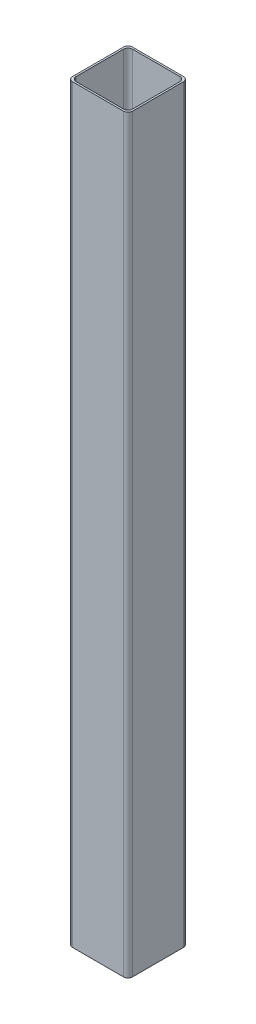
ISO-10303-21;
HEADER;
FILE_DESCRIPTION(('STEP AP214'),'2;1');
FILE_NAME('part.step','',(''),(''),'','','');
FILE_SCHEMA(('AUTOMOTIVE_DESIGN { 1 0 10303 214 1 1 1 1 }'));
ENDSEC;
DATA;
#1=APPLICATION_CONTEXT('core data for automotive mechanical design processes');
#2=APPLICATION_PROTOCOL_DEFINITION('international standard','automotive_design',2000,#1);
#3=PRODUCT_CONTEXT('',#1,'mechanical');
#4=PRODUCT('Part','Part','',(#3));
#5=PRODUCT_RELATED_PRODUCT_CATEGORY('part','',(#4));
#6=PRODUCT_DEFINITION_FORMATION('','',#4);
#7=PRODUCT_DEFINITION_CONTEXT('part definition',#1,'design');
#8=PRODUCT_DEFINITION('design','',#6,#7);
#9=PRODUCT_DEFINITION_SHAPE('','',#8);
#10=(LENGTH_UNIT() NAMED_UNIT(*) SI_UNIT(.MILLI.,.METRE.));
#11=(NAMED_UNIT(*) PLANE_ANGLE_UNIT() SI_UNIT($,.RADIAN.));
#12=(NAMED_UNIT(*) SI_UNIT($,.STERADIAN.) SOLID_ANGLE_UNIT());
#13=UNCERTAINTY_MEASURE_WITH_UNIT(LENGTH_MEASURE(1.E-05),#10,'distance_accuracy_value','');
#14=(GEOMETRIC_REPRESENTATION_CONTEXT(3) GLOBAL_UNCERTAINTY_ASSIGNED_CONTEXT((#13)) GLOBAL_UNIT_ASSIGNED_CONTEXT((#10,
#11,#12)) REPRESENTATION_CONTEXT('',''));
#15=CARTESIAN_POINT('',(0.,0.,0.));
#16=DIRECTION('',(0.,0.,1.));
#17=DIRECTION('',(1.,0.,0.));
#18=AXIS2_PLACEMENT_3D('',#15,#16,#17);
#19=CARTESIAN_POINT('',(0.,250.,0.));
#20=DIRECTION('',(0.,1.,0.));
#21=DIRECTION('',(0.,0.,1.));
#22=AXIS2_PLACEMENT_3D('',#19,#20,#21);
#23=PLANE('',#22);
#24=DIRECTION('',(-1.,0.,0.));
#25=VECTOR('',#24,1.);
#26=CARTESIAN_POINT('',(20.,250.,-20.));
#27=LINE('',#26,#25);
#28=CARTESIAN_POINT('',(17.,250.,-20.));
#29=VERTEX_POINT('',#28);
#30=CARTESIAN_POINT('',(-17.,250.,-20.));
#31=VERTEX_POINT('',#30);
#32=EDGE_CURVE('E183',#29,#31,#27,.T.);
#33=ORIENTED_EDGE('',*,*,#32,.T.);
#34=CARTESIAN_POINT('',(-17.,250.,-17.));
#35=DIRECTION('',(0.,1.,0.));
#36=DIRECTION('',(0.,0.,1.));
#37=AXIS2_PLACEMENT_3D('',#34,#35,#36);
#38=CIRCLE('',#37,3.);
#39=CARTESIAN_POINT('',(-20.,250.,-17.));
#40=VERTEX_POINT('',#39);
#41=EDGE_CURVE('E203',#31,#40,#38,.T.);
#42=ORIENTED_EDGE('',*,*,#41,.T.);
#43=DIRECTION('',(0.,0.,1.));
#44=VECTOR('',#43,1.);
#45=CARTESIAN_POINT('',(-20.,250.,20.));
#46=LINE('',#45,#44);
#47=CARTESIAN_POINT('',(-20.,250.,17.));
#48=VERTEX_POINT('',#47);
#49=EDGE_CURVE('E165',#40,#48,#46,.T.);
#50=ORIENTED_EDGE('',*,*,#49,.T.);
#51=CARTESIAN_POINT('',(-17.,250.,17.));
#52=DIRECTION('',(0.,1.,0.));
#53=DIRECTION('',(0.,0.,1.));
#54=AXIS2_PLACEMENT_3D('',#51,#52,#53);
#55=CIRCLE('',#54,3.);
#56=CARTESIAN_POINT('',(-17.,250.,20.));
#57=VERTEX_POINT('',#56);
#58=EDGE_CURVE('E199',#48,#57,#55,.T.);
#59=ORIENTED_EDGE('',*,*,#58,.T.);
#60=DIRECTION('',(1.,0.,0.));
#61=VECTOR('',#60,1.);
#62=CARTESIAN_POINT('',(20.,250.,20.));
#63=LINE('',#62,#61);
#64=CARTESIAN_POINT('',(17.,250.,20.));
#65=VERTEX_POINT('',#64);
#66=EDGE_CURVE('E275',#57,#65,#63,.T.);
#67=ORIENTED_EDGE('',*,*,#66,.T.);
#68=CARTESIAN_POINT('',(17.,250.,17.));
#69=DIRECTION('',(0.,1.,0.));
#70=DIRECTION('',(0.,0.,1.));
#71=AXIS2_PLACEMENT_3D('',#68,#69,#70);
#72=CIRCLE('',#71,3.);
#73=CARTESIAN_POINT('',(20.,250.,17.));
#74=VERTEX_POINT('',#73);
#75=EDGE_CURVE('E197',#65,#74,#72,.T.);
#76=ORIENTED_EDGE('',*,*,#75,.T.);
#77=DIRECTION('',(0.,0.,-1.));
#78=VECTOR('',#77,1.);
#79=CARTESIAN_POINT('',(20.,250.,20.));
#80=LINE('',#79,#78);
#81=CARTESIAN_POINT('',(20.,250.,-17.));
#82=VERTEX_POINT('',#81);
#83=EDGE_CURVE('E277',#74,#82,#80,.T.);
#84=ORIENTED_EDGE('',*,*,#83,.T.);
#85=CARTESIAN_POINT('',(17.,250.,-17.));
#86=DIRECTION('',(0.,1.,0.));
#87=DIRECTION('',(0.,0.,1.));
#88=AXIS2_PLACEMENT_3D('',#85,#86,#87);
#89=CIRCLE('',#88,3.);
#90=EDGE_CURVE('E201',#82,#29,#89,.T.);
#91=ORIENTED_EDGE('',*,*,#90,.T.);
#92=EDGE_LOOP('',(#33,#42,#50,#59,#67,#76,#84,#91));
#93=FACE_BOUND('',#92,.T.);
#94=DIRECTION('',(0.,0.,-1.));
#95=VECTOR('',#94,1.);
#96=CARTESIAN_POINT('',(18.8,250.,18.8));
#97=LINE('',#96,#95);
#98=CARTESIAN_POINT('',(18.8,250.,15.8));
#99=VERTEX_POINT('',#98);
#100=CARTESIAN_POINT('',(18.8,250.,-15.8));
#101=VERTEX_POINT('',#100);
#102=EDGE_CURVE('E261',#99,#101,#97,.T.);
#103=ORIENTED_EDGE('',*,*,#102,.F.);
#104=CARTESIAN_POINT('',(15.8,250.,15.8));
#105=DIRECTION('',(0.,1.,0.));
#106=DIRECTION('',(0.,0.,1.));
#107=AXIS2_PLACEMENT_3D('',#104,#105,#106);
#108=CIRCLE('',#107,3.);
#109=CARTESIAN_POINT('',(15.8,250.,18.8));
#110=VERTEX_POINT('',#109);
#111=EDGE_CURVE('E240',#99,#110,#108,.F.);
#112=ORIENTED_EDGE('',*,*,#111,.T.);
#113=DIRECTION('',(1.,0.,0.));
#114=VECTOR('',#113,1.);
#115=CARTESIAN_POINT('',(18.8,250.,18.8));
#116=LINE('',#115,#114);
#117=CARTESIAN_POINT('',(-15.8,250.,18.8));
#118=VERTEX_POINT('',#117);
#119=EDGE_CURVE('E256',#118,#110,#116,.T.);
#120=ORIENTED_EDGE('',*,*,#119,.F.);
#121=CARTESIAN_POINT('',(-15.8,250.,15.8));
#122=DIRECTION('',(0.,1.,0.));
#123=DIRECTION('',(0.,0.,1.));
#124=AXIS2_PLACEMENT_3D('',#121,#122,#123);
#125=CIRCLE('',#124,3.);
#126=CARTESIAN_POINT('',(-18.8,250.,15.8));
#127=VERTEX_POINT('',#126);
#128=EDGE_CURVE('E244',#118,#127,#125,.F.);
#129=ORIENTED_EDGE('',*,*,#128,.T.);
#130=DIRECTION('',(0.,0.,1.));
#131=VECTOR('',#130,1.);
#132=CARTESIAN_POINT('',(-18.8,250.,18.8));
#133=LINE('',#132,#131);
#134=CARTESIAN_POINT('',(-18.8,250.,-15.8));
#135=VERTEX_POINT('',#134);
#136=EDGE_CURVE('E174',#135,#127,#133,.T.);
#137=ORIENTED_EDGE('',*,*,#136,.F.);
#138=CARTESIAN_POINT('',(-15.8,250.,-15.8));
#139=DIRECTION('',(0.,1.,0.));
#140=DIRECTION('',(0.,0.,1.));
#141=AXIS2_PLACEMENT_3D('',#138,#139,#140);
#142=CIRCLE('',#141,3.);
#143=CARTESIAN_POINT('',(-15.8,250.,-18.8));
#144=VERTEX_POINT('',#143);
#145=EDGE_CURVE('E11',#135,#144,#142,.F.);
#146=ORIENTED_EDGE('',*,*,#145,.T.);
#147=DIRECTION('',(-1.,0.,0.));
#148=VECTOR('',#147,1.);
#149=CARTESIAN_POINT('',(18.8,250.,-18.8));
#150=LINE('',#149,#148);
#151=CARTESIAN_POINT('',(15.8,250.,-18.8));
#152=VERTEX_POINT('',#151);
#153=EDGE_CURVE('E180',#152,#144,#150,.T.);
#154=ORIENTED_EDGE('',*,*,#153,.F.);
#155=CARTESIAN_POINT('',(15.8,250.,-15.8));
#156=DIRECTION('',(0.,1.,0.));
#157=DIRECTION('',(0.,0.,1.));
#158=AXIS2_PLACEMENT_3D('',#155,#156,#157);
#159=CIRCLE('',#158,3.);
#160=EDGE_CURVE('E236',#152,#101,#159,.F.);
#161=ORIENTED_EDGE('',*,*,#160,.T.);
#162=EDGE_LOOP('',(#103,#112,#120,#129,#137,#146,#154,#161));
#163=FACE_BOUND('',#162,.T.);
#164=ADVANCED_FACE('F32',(#93,#163),#23,.T.);
#165=CARTESIAN_POINT('',(0.,-250.,0.));
#166=DIRECTION('',(0.,1.,0.));
#167=DIRECTION('',(0.,0.,1.));
#168=AXIS2_PLACEMENT_3D('',#165,#166,#167);
#169=PLANE('',#168);
#170=DIRECTION('',(0.,0.,1.));
#171=VECTOR('',#170,1.);
#172=CARTESIAN_POINT('',(-20.,-250.,20.));
#173=LINE('',#172,#171);
#174=CARTESIAN_POINT('',(-20.,-250.,-17.));
#175=VERTEX_POINT('',#174);
#176=CARTESIAN_POINT('',(-20.,-250.,17.));
#177=VERTEX_POINT('',#176);
#178=EDGE_CURVE('E162',#175,#177,#173,.T.);
#179=ORIENTED_EDGE('',*,*,#178,.F.);
#180=CARTESIAN_POINT('',(-17.,-250.,-17.));
#181=DIRECTION('',(0.,1.,0.));
#182=DIRECTION('',(0.,0.,1.));
#183=AXIS2_PLACEMENT_3D('',#180,#181,#182);
#184=CIRCLE('',#183,3.);
#185=CARTESIAN_POINT('',(-17.,-250.,-20.));
#186=VERTEX_POINT('',#185);
#187=EDGE_CURVE('E145',#175,#186,#184,.F.);
#188=ORIENTED_EDGE('',*,*,#187,.T.);
#189=DIRECTION('',(-1.,0.,0.));
#190=VECTOR('',#189,1.);
#191=CARTESIAN_POINT('',(20.,-250.,-20.));
#192=LINE('',#191,#190);
#193=CARTESIAN_POINT('',(17.,-250.,-20.));
#194=VERTEX_POINT('',#193);
#195=EDGE_CURVE('E188',#194,#186,#192,.T.);
#196=ORIENTED_EDGE('',*,*,#195,.F.);
#197=CARTESIAN_POINT('',(17.,-250.,-17.));
#198=DIRECTION('',(0.,1.,0.));
#199=DIRECTION('',(0.,0.,1.));
#200=AXIS2_PLACEMENT_3D('',#197,#198,#199);
#201=CIRCLE('',#200,3.);
#202=CARTESIAN_POINT('',(20.,-250.,-17.));
#203=VERTEX_POINT('',#202);
#204=EDGE_CURVE('E156',#194,#203,#201,.F.);
#205=ORIENTED_EDGE('',*,*,#204,.T.);
#206=DIRECTION('',(0.,0.,-1.));
#207=VECTOR('',#206,1.);
#208=CARTESIAN_POINT('',(20.,-250.,20.));
#209=LINE('',#208,#207);
#210=CARTESIAN_POINT('',(20.,-250.,17.));
#211=VERTEX_POINT('',#210);
#212=EDGE_CURVE('E177',#211,#203,#209,.T.);
#213=ORIENTED_EDGE('',*,*,#212,.F.);
#214=CARTESIAN_POINT('',(17.,-250.,17.));
#215=DIRECTION('',(0.,1.,0.));
#216=DIRECTION('',(0.,0.,1.));
#217=AXIS2_PLACEMENT_3D('',#214,#215,#216);
#218=CIRCLE('',#217,3.);
#219=CARTESIAN_POINT('',(17.,-250.,20.));
#220=VERTEX_POINT('',#219);
#221=EDGE_CURVE('E166',#211,#220,#218,.F.);
#222=ORIENTED_EDGE('',*,*,#221,.T.);
#223=DIRECTION('',(1.,0.,0.));
#224=VECTOR('',#223,1.);
#225=CARTESIAN_POINT('',(20.,-250.,20.));
#226=LINE('',#225,#224);
#227=CARTESIAN_POINT('',(-17.,-250.,20.));
#228=VERTEX_POINT('',#227);
#229=EDGE_CURVE('E173',#228,#220,#226,.T.);
#230=ORIENTED_EDGE('',*,*,#229,.F.);
#231=CARTESIAN_POINT('',(-17.,-250.,17.));
#232=DIRECTION('',(0.,1.,0.));
#233=DIRECTION('',(0.,0.,1.));
#234=AXIS2_PLACEMENT_3D('',#231,#232,#233);
#235=CIRCLE('',#234,3.);
#236=EDGE_CURVE('E172',#228,#177,#235,.F.);
#237=ORIENTED_EDGE('',*,*,#236,.T.);
#238=EDGE_LOOP('',(#179,#188,#196,#205,#213,#222,#230,#237));
#239=FACE_BOUND('',#238,.T.);
#240=DIRECTION('',(0.,0.,1.));
#241=VECTOR('',#240,1.);
#242=CARTESIAN_POINT('',(-18.8,-250.,18.8));
#243=LINE('',#242,#241);
#244=CARTESIAN_POINT('',(-18.8,-250.,-15.8));
#245=VERTEX_POINT('',#244);
#246=CARTESIAN_POINT('',(-18.8,-250.,15.8));
#247=VERTEX_POINT('',#246);
#248=EDGE_CURVE('E248',#245,#247,#243,.T.);
#249=ORIENTED_EDGE('',*,*,#248,.T.);
#250=CARTESIAN_POINT('',(-15.8,-250.,15.8));
#251=DIRECTION('',(0.,1.,0.));
#252=DIRECTION('',(0.,0.,1.));
#253=AXIS2_PLACEMENT_3D('',#250,#251,#252);
#254=CIRCLE('',#253,3.);
#255=CARTESIAN_POINT('',(-15.8,-250.,18.8));
#256=VERTEX_POINT('',#255);
#257=EDGE_CURVE('E242',#247,#256,#254,.T.);
#258=ORIENTED_EDGE('',*,*,#257,.T.);
#259=DIRECTION('',(1.,0.,0.));
#260=VECTOR('',#259,1.);
#261=CARTESIAN_POINT('',(18.8,-250.,18.8));
#262=LINE('',#261,#260);
#263=CARTESIAN_POINT('',(15.8,-250.,18.8));
#264=VERTEX_POINT('',#263);
#265=EDGE_CURVE('E267',#256,#264,#262,.T.);
#266=ORIENTED_EDGE('',*,*,#265,.T.);
#267=CARTESIAN_POINT('',(15.8,-250.,15.8));
#268=DIRECTION('',(0.,1.,0.));
#269=DIRECTION('',(0.,0.,1.));
#270=AXIS2_PLACEMENT_3D('',#267,#268,#269);
#271=CIRCLE('',#270,3.);
#272=CARTESIAN_POINT('',(18.8,-250.,15.8));
#273=VERTEX_POINT('',#272);
#274=EDGE_CURVE('E238',#264,#273,#271,.T.);
#275=ORIENTED_EDGE('',*,*,#274,.T.);
#276=DIRECTION('',(0.,0.,-1.));
#277=VECTOR('',#276,1.);
#278=CARTESIAN_POINT('',(18.8,-250.,18.8));
#279=LINE('',#278,#277);
#280=CARTESIAN_POINT('',(18.8,-250.,-15.8));
#281=VERTEX_POINT('',#280);
#282=EDGE_CURVE('E270',#273,#281,#279,.T.);
#283=ORIENTED_EDGE('',*,*,#282,.T.);
#284=CARTESIAN_POINT('',(15.8,-250.,-15.8));
#285=DIRECTION('',(0.,1.,0.));
#286=DIRECTION('',(0.,0.,1.));
#287=AXIS2_PLACEMENT_3D('',#284,#285,#286);
#288=CIRCLE('',#287,3.);
#289=CARTESIAN_POINT('',(15.8,-250.,-18.8));
#290=VERTEX_POINT('',#289);
#291=EDGE_CURVE('E234',#281,#290,#288,.T.);
#292=ORIENTED_EDGE('',*,*,#291,.T.);
#293=DIRECTION('',(-1.,0.,0.));
#294=VECTOR('',#293,1.);
#295=CARTESIAN_POINT('',(18.8,-250.,-18.8));
#296=LINE('',#295,#294);
#297=CARTESIAN_POINT('',(-15.8,-250.,-18.8));
#298=VERTEX_POINT('',#297);
#299=EDGE_CURVE('E249',#290,#298,#296,.T.);
#300=ORIENTED_EDGE('',*,*,#299,.T.);
#301=CARTESIAN_POINT('',(-15.8,-250.,-15.8));
#302=DIRECTION('',(0.,1.,0.));
#303=DIRECTION('',(0.,0.,1.));
#304=AXIS2_PLACEMENT_3D('',#301,#302,#303);
#305=CIRCLE('',#304,3.);
#306=EDGE_CURVE('E40',#298,#245,#305,.T.);
#307=ORIENTED_EDGE('',*,*,#306,.T.);
#308=EDGE_LOOP('',(#249,#258,#266,#275,#283,#292,#300,#307));
#309=FACE_BOUND('',#308,.T.);
#310=ADVANCED_FACE('F169',(#239,#309),#169,.F.);
#311=CARTESIAN_POINT('',(-20.,250.,20.));
#312=DIRECTION('',(1.,0.,0.));
#313=DIRECTION('',(0.,0.,-1.));
#314=AXIS2_PLACEMENT_3D('',#311,#312,#313);
#315=PLANE('',#314);
#316=ORIENTED_EDGE('',*,*,#49,.F.);
#317=DIRECTION('',(0.,-1.,0.));
#318=VECTOR('',#317,1.);
#319=CARTESIAN_POINT('',(-20.,250.,-17.));
#320=LINE('',#319,#318);
#321=EDGE_CURVE('E149',#40,#175,#320,.T.);
#322=ORIENTED_EDGE('',*,*,#321,.T.);
#323=ORIENTED_EDGE('',*,*,#178,.T.);
#324=DIRECTION('',(0.,-1.,0.));
#325=VECTOR('',#324,1.);
#326=CARTESIAN_POINT('',(-20.,250.,17.));
#327=LINE('',#326,#325);
#328=EDGE_CURVE('E167',#177,#48,#327,.F.);
#329=ORIENTED_EDGE('',*,*,#328,.T.);
#330=EDGE_LOOP('',(#316,#322,#323,#329));
#331=FACE_BOUND('',#330,.T.);
#332=ADVANCED_FACE('F161',(#331),#315,.F.);
#333=CARTESIAN_POINT('',(20.,250.,20.));
#334=DIRECTION('',(0.,0.,-1.));
#335=DIRECTION('',(-1.,0.,0.));
#336=AXIS2_PLACEMENT_3D('',#333,#334,#335);
#337=PLANE('',#336);
#338=ORIENTED_EDGE('',*,*,#66,.F.);
#339=DIRECTION('',(0.,-1.,0.));
#340=VECTOR('',#339,1.);
#341=CARTESIAN_POINT('',(-17.,250.,20.));
#342=LINE('',#341,#340);
#343=EDGE_CURVE('E231',#57,#228,#342,.T.);
#344=ORIENTED_EDGE('',*,*,#343,.T.);
#345=ORIENTED_EDGE('',*,*,#229,.T.);
#346=DIRECTION('',(0.,-1.,0.));
#347=VECTOR('',#346,1.);
#348=CARTESIAN_POINT('',(17.,250.,20.));
#349=LINE('',#348,#347);
#350=EDGE_CURVE('E229',#220,#65,#349,.F.);
#351=ORIENTED_EDGE('',*,*,#350,.T.);
#352=EDGE_LOOP('',(#338,#344,#345,#351));
#353=FACE_BOUND('',#352,.T.);
#354=ADVANCED_FACE('F299',(#353),#337,.F.);
#355=CARTESIAN_POINT('',(20.,250.,20.));
#356=DIRECTION('',(-1.,0.,0.));
#357=DIRECTION('',(0.,0.,1.));
#358=AXIS2_PLACEMENT_3D('',#355,#356,#357);
#359=PLANE('',#358);
#360=ORIENTED_EDGE('',*,*,#212,.T.);
#361=DIRECTION('',(0.,-1.,0.));
#362=VECTOR('',#361,1.);
#363=CARTESIAN_POINT('',(20.,250.,-17.));
#364=LINE('',#363,#362);
#365=EDGE_CURVE('E208',#203,#82,#364,.F.);
#366=ORIENTED_EDGE('',*,*,#365,.T.);
#367=ORIENTED_EDGE('',*,*,#83,.F.);
#368=DIRECTION('',(0.,-1.,0.));
#369=VECTOR('',#368,1.);
#370=CARTESIAN_POINT('',(20.,250.,17.));
#371=LINE('',#370,#369);
#372=EDGE_CURVE('E205',#74,#211,#371,.T.);
#373=ORIENTED_EDGE('',*,*,#372,.T.);
#374=EDGE_LOOP('',(#360,#366,#367,#373));
#375=FACE_BOUND('',#374,.T.);
#376=ADVANCED_FACE('F292',(#375),#359,.F.);
#377=CARTESIAN_POINT('',(20.,250.,-20.));
#378=DIRECTION('',(0.,0.,1.));
#379=DIRECTION('',(1.,0.,0.));
#380=AXIS2_PLACEMENT_3D('',#377,#378,#379);
#381=PLANE('',#380);
#382=ORIENTED_EDGE('',*,*,#195,.T.);
#383=DIRECTION('',(0.,-1.,0.));
#384=VECTOR('',#383,1.);
#385=CARTESIAN_POINT('',(-17.,250.,-20.));
#386=LINE('',#385,#384);
#387=EDGE_CURVE('E150',#186,#31,#386,.F.);
#388=ORIENTED_EDGE('',*,*,#387,.T.);
#389=ORIENTED_EDGE('',*,*,#32,.F.);
#390=DIRECTION('',(0.,-1.,0.));
#391=VECTOR('',#390,1.);
#392=CARTESIAN_POINT('',(17.,250.,-20.));
#393=LINE('',#392,#391);
#394=EDGE_CURVE('E155',#29,#194,#393,.T.);
#395=ORIENTED_EDGE('',*,*,#394,.T.);
#396=EDGE_LOOP('',(#382,#388,#389,#395));
#397=FACE_BOUND('',#396,.T.);
#398=ADVANCED_FACE('F286',(#397),#381,.F.);
#399=CARTESIAN_POINT('',(18.8,250.,18.8));
#400=DIRECTION('',(0.,0.,-1.));
#401=DIRECTION('',(-1.,0.,0.));
#402=AXIS2_PLACEMENT_3D('',#399,#400,#401);
#403=PLANE('',#402);
#404=ORIENTED_EDGE('',*,*,#119,.T.);
#405=DIRECTION('',(0.,-1.,0.));
#406=VECTOR('',#405,1.);
#407=CARTESIAN_POINT('',(15.8,-250.,18.8));
#408=LINE('',#407,#406);
#409=EDGE_CURVE('E221',#110,#264,#408,.T.);
#410=ORIENTED_EDGE('',*,*,#409,.T.);
#411=ORIENTED_EDGE('',*,*,#265,.F.);
#412=DIRECTION('',(0.,-1.,0.));
#413=VECTOR('',#412,1.);
#414=CARTESIAN_POINT('',(-15.8,250.,18.8));
#415=LINE('',#414,#413);
#416=EDGE_CURVE('E219',#256,#118,#415,.F.);
#417=ORIENTED_EDGE('',*,*,#416,.T.);
#418=EDGE_LOOP('',(#404,#410,#411,#417));
#419=FACE_BOUND('',#418,.T.);
#420=ADVANCED_FACE('F318',(#419),#403,.T.);
#421=CARTESIAN_POINT('',(18.8,250.,18.8));
#422=DIRECTION('',(-1.,0.,0.));
#423=DIRECTION('',(0.,0.,1.));
#424=AXIS2_PLACEMENT_3D('',#421,#422,#423);
#425=PLANE('',#424);
#426=ORIENTED_EDGE('',*,*,#102,.T.);
#427=DIRECTION('',(0.,-1.,0.));
#428=VECTOR('',#427,1.);
#429=CARTESIAN_POINT('',(18.8,-250.,-15.8));
#430=LINE('',#429,#428);
#431=EDGE_CURVE('E212',#101,#281,#430,.T.);
#432=ORIENTED_EDGE('',*,*,#431,.T.);
#433=ORIENTED_EDGE('',*,*,#282,.F.);
#434=DIRECTION('',(0.,-1.,0.));
#435=VECTOR('',#434,1.);
#436=CARTESIAN_POINT('',(18.8,250.,15.8));
#437=LINE('',#436,#435);
#438=EDGE_CURVE('E210',#273,#99,#437,.F.);
#439=ORIENTED_EDGE('',*,*,#438,.T.);
#440=EDGE_LOOP('',(#426,#432,#433,#439));
#441=FACE_BOUND('',#440,.T.);
#442=ADVANCED_FACE('F357',(#441),#425,.T.);
#443=CARTESIAN_POINT('',(18.8,250.,-18.8));
#444=DIRECTION('',(0.,0.,1.));
#445=DIRECTION('',(1.,0.,0.));
#446=AXIS2_PLACEMENT_3D('',#443,#444,#445);
#447=PLANE('',#446);
#448=ORIENTED_EDGE('',*,*,#299,.F.);
#449=DIRECTION('',(0.,-1.,0.));
#450=VECTOR('',#449,1.);
#451=CARTESIAN_POINT('',(15.8,250.,-18.8));
#452=LINE('',#451,#450);
#453=EDGE_CURVE('E52',#290,#152,#452,.F.);
#454=ORIENTED_EDGE('',*,*,#453,.T.);
#455=ORIENTED_EDGE('',*,*,#153,.T.);
#456=DIRECTION('',(0.,-1.,0.));
#457=VECTOR('',#456,1.);
#458=CARTESIAN_POINT('',(-15.8,-250.,-18.8));
#459=LINE('',#458,#457);
#460=EDGE_CURVE('E215',#144,#298,#459,.T.);
#461=ORIENTED_EDGE('',*,*,#460,.T.);
#462=EDGE_LOOP('',(#448,#454,#455,#461));
#463=FACE_BOUND('',#462,.T.);
#464=ADVANCED_FACE('F259',(#463),#447,.T.);
#465=CARTESIAN_POINT('',(-18.8,250.,18.8));
#466=DIRECTION('',(1.,0.,0.));
#467=DIRECTION('',(0.,0.,-1.));
#468=AXIS2_PLACEMENT_3D('',#465,#466,#467);
#469=PLANE('',#468);
#470=ORIENTED_EDGE('',*,*,#136,.T.);
#471=DIRECTION('',(0.,-1.,0.));
#472=VECTOR('',#471,1.);
#473=CARTESIAN_POINT('',(-18.8,-250.,15.8));
#474=LINE('',#473,#472);
#475=EDGE_CURVE('E226',#127,#247,#474,.T.);
#476=ORIENTED_EDGE('',*,*,#475,.T.);
#477=ORIENTED_EDGE('',*,*,#248,.F.);
#478=DIRECTION('',(0.,-1.,0.));
#479=VECTOR('',#478,1.);
#480=CARTESIAN_POINT('',(-18.8,250.,-15.8));
#481=LINE('',#480,#479);
#482=EDGE_CURVE('E224',#245,#135,#481,.F.);
#483=ORIENTED_EDGE('',*,*,#482,.T.);
#484=EDGE_LOOP('',(#470,#476,#477,#483));
#485=FACE_BOUND('',#484,.T.);
#486=ADVANCED_FACE('F254',(#485),#469,.T.);
#487=CARTESIAN_POINT('',(-17.,250.,-17.));
#488=DIRECTION('',(0.,-1.,0.));
#489=DIRECTION('',(0.,0.,-1.));
#490=AXIS2_PLACEMENT_3D('',#487,#488,#489);
#491=CYLINDRICAL_SURFACE('',#490,3.);
#492=ORIENTED_EDGE('',*,*,#41,.F.);
#493=ORIENTED_EDGE('',*,*,#387,.F.);
#494=ORIENTED_EDGE('',*,*,#187,.F.);
#495=ORIENTED_EDGE('',*,*,#321,.F.);
#496=EDGE_LOOP('',(#492,#493,#494,#495));
#497=FACE_BOUND('',#496,.T.);
#498=ADVANCED_FACE('F148',(#497),#491,.T.);
#499=CARTESIAN_POINT('',(17.,250.,-17.));
#500=DIRECTION('',(0.,-1.,0.));
#501=DIRECTION('',(0.,0.,-1.));
#502=AXIS2_PLACEMENT_3D('',#499,#500,#501);
#503=CYLINDRICAL_SURFACE('',#502,3.);
#504=ORIENTED_EDGE('',*,*,#90,.F.);
#505=ORIENTED_EDGE('',*,*,#365,.F.);
#506=ORIENTED_EDGE('',*,*,#204,.F.);
#507=ORIENTED_EDGE('',*,*,#394,.F.);
#508=EDGE_LOOP('',(#504,#505,#506,#507));
#509=FACE_BOUND('',#508,.T.);
#510=ADVANCED_FACE('F288',(#509),#503,.T.);
#511=CARTESIAN_POINT('',(15.8,250.,-15.8));
#512=DIRECTION('',(0.,1.,0.));
#513=DIRECTION('',(0.,0.,1.));
#514=AXIS2_PLACEMENT_3D('',#511,#512,#513);
#515=CYLINDRICAL_SURFACE('',#514,3.);
#516=ORIENTED_EDGE('',*,*,#160,.F.);
#517=ORIENTED_EDGE('',*,*,#453,.F.);
#518=ORIENTED_EDGE('',*,*,#291,.F.);
#519=ORIENTED_EDGE('',*,*,#431,.F.);
#520=EDGE_LOOP('',(#516,#517,#518,#519));
#521=FACE_BOUND('',#520,.T.);
#522=ADVANCED_FACE('F333',(#521),#515,.F.);
#523=CARTESIAN_POINT('',(15.8,250.,15.8));
#524=DIRECTION('',(0.,1.,0.));
#525=DIRECTION('',(0.,0.,1.));
#526=AXIS2_PLACEMENT_3D('',#523,#524,#525);
#527=CYLINDRICAL_SURFACE('',#526,3.);
#528=ORIENTED_EDGE('',*,*,#111,.F.);
#529=ORIENTED_EDGE('',*,*,#438,.F.);
#530=ORIENTED_EDGE('',*,*,#274,.F.);
#531=ORIENTED_EDGE('',*,*,#409,.F.);
#532=EDGE_LOOP('',(#528,#529,#530,#531));
#533=FACE_BOUND('',#532,.T.);
#534=ADVANCED_FACE('F336',(#533),#527,.F.);
#535=CARTESIAN_POINT('',(-15.8,250.,15.8));
#536=DIRECTION('',(0.,1.,0.));
#537=DIRECTION('',(0.,0.,1.));
#538=AXIS2_PLACEMENT_3D('',#535,#536,#537);
#539=CYLINDRICAL_SURFACE('',#538,3.);
#540=ORIENTED_EDGE('',*,*,#128,.F.);
#541=ORIENTED_EDGE('',*,*,#416,.F.);
#542=ORIENTED_EDGE('',*,*,#257,.F.);
#543=ORIENTED_EDGE('',*,*,#475,.F.);
#544=EDGE_LOOP('',(#540,#541,#542,#543));
#545=FACE_BOUND('',#544,.T.);
#546=ADVANCED_FACE('F309',(#545),#539,.F.);
#547=CARTESIAN_POINT('',(-15.8,250.,-15.8));
#548=DIRECTION('',(0.,1.,0.));
#549=DIRECTION('',(0.,0.,1.));
#550=AXIS2_PLACEMENT_3D('',#547,#548,#549);
#551=CYLINDRICAL_SURFACE('',#550,3.);
#552=ORIENTED_EDGE('',*,*,#145,.F.);
#553=ORIENTED_EDGE('',*,*,#482,.F.);
#554=ORIENTED_EDGE('',*,*,#306,.F.);
#555=ORIENTED_EDGE('',*,*,#460,.F.);
#556=EDGE_LOOP('',(#552,#553,#554,#555));
#557=FACE_BOUND('',#556,.T.);
#558=ADVANCED_FACE('F258',(#557),#551,.F.);
#559=CARTESIAN_POINT('',(-17.,250.,17.));
#560=DIRECTION('',(0.,-1.,0.));
#561=DIRECTION('',(0.,0.,-1.));
#562=AXIS2_PLACEMENT_3D('',#559,#560,#561);
#563=CYLINDRICAL_SURFACE('',#562,3.);
#564=ORIENTED_EDGE('',*,*,#58,.F.);
#565=ORIENTED_EDGE('',*,*,#328,.F.);
#566=ORIENTED_EDGE('',*,*,#236,.F.);
#567=ORIENTED_EDGE('',*,*,#343,.F.);
#568=EDGE_LOOP('',(#564,#565,#566,#567));
#569=FACE_BOUND('',#568,.T.);
#570=ADVANCED_FACE('F303',(#569),#563,.T.);
#571=CARTESIAN_POINT('',(17.,250.,17.));
#572=DIRECTION('',(0.,-1.,0.));
#573=DIRECTION('',(0.,0.,-1.));
#574=AXIS2_PLACEMENT_3D('',#571,#572,#573);
#575=CYLINDRICAL_SURFACE('',#574,3.);
#576=ORIENTED_EDGE('',*,*,#75,.F.);
#577=ORIENTED_EDGE('',*,*,#350,.F.);
#578=ORIENTED_EDGE('',*,*,#221,.F.);
#579=ORIENTED_EDGE('',*,*,#372,.F.);
#580=EDGE_LOOP('',(#576,#577,#578,#579));
#581=FACE_BOUND('',#580,.T.);
#582=ADVANCED_FACE('F34',(#581),#575,.T.);
#583=CLOSED_SHELL('',(#164,#310,#332,#354,#376,#398,#420,#442,#464,#486,#498,#510,#522,#534,
#546,#558,#570,#582));
#584=MANIFOLD_SOLID_BREP('B2',#583);
#585=ADVANCED_BREP_SHAPE_REPRESENTATION('',(#18,#584),#14);
#586=SHAPE_DEFINITION_REPRESENTATION(#9,#585);
ENDSEC;
END-ISO-10303-21;
